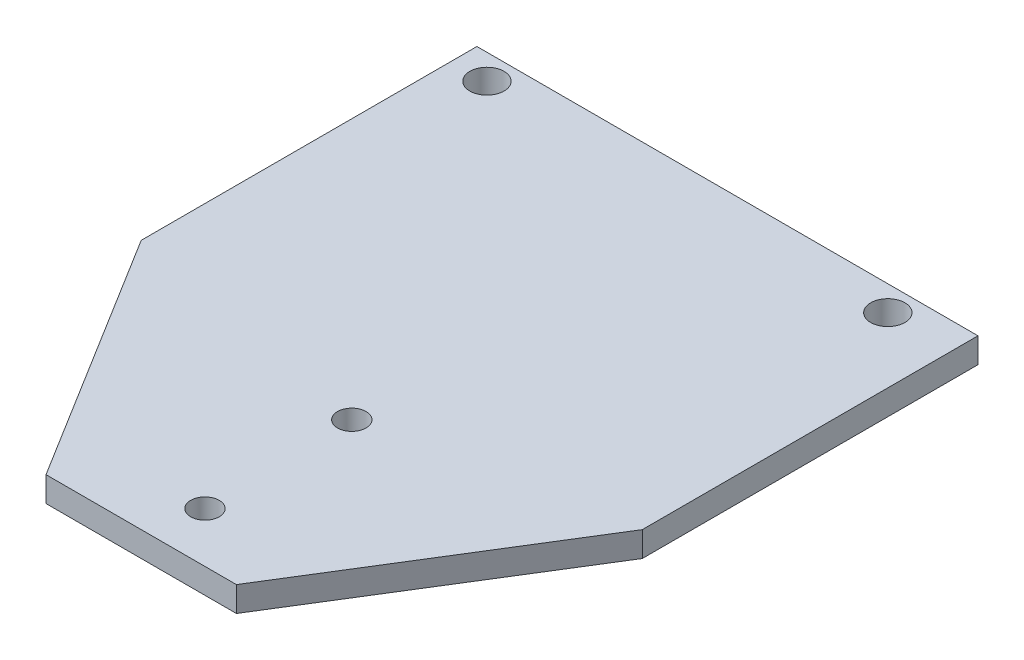
ISO-10303-21;
HEADER;
FILE_DESCRIPTION(('STEP AP214'),'2;1');
FILE_NAME('part.step','',(''),(''),'','','');
FILE_SCHEMA(('AUTOMOTIVE_DESIGN { 1 0 10303 214 1 1 1 1 }'));
ENDSEC;
DATA;
#1=APPLICATION_CONTEXT('core data for automotive mechanical design processes');
#2=APPLICATION_PROTOCOL_DEFINITION('international standard','automotive_design',2000,#1);
#3=PRODUCT_CONTEXT('',#1,'mechanical');
#4=PRODUCT('Part','Part','',(#3));
#5=PRODUCT_RELATED_PRODUCT_CATEGORY('part','',(#4));
#6=PRODUCT_DEFINITION_FORMATION('','',#4);
#7=PRODUCT_DEFINITION_CONTEXT('part definition',#1,'design');
#8=PRODUCT_DEFINITION('design','',#6,#7);
#9=PRODUCT_DEFINITION_SHAPE('','',#8);
#10=(LENGTH_UNIT() NAMED_UNIT(*) SI_UNIT(.MILLI.,.METRE.));
#11=(NAMED_UNIT(*) PLANE_ANGLE_UNIT() SI_UNIT($,.RADIAN.));
#12=(NAMED_UNIT(*) SI_UNIT($,.STERADIAN.) SOLID_ANGLE_UNIT());
#13=UNCERTAINTY_MEASURE_WITH_UNIT(LENGTH_MEASURE(1.E-05),#10,'distance_accuracy_value','');
#14=(GEOMETRIC_REPRESENTATION_CONTEXT(3) GLOBAL_UNCERTAINTY_ASSIGNED_CONTEXT((#13)) GLOBAL_UNIT_ASSIGNED_CONTEXT((#10,
#11,#12)) REPRESENTATION_CONTEXT('',''));
#15=CARTESIAN_POINT('',(0.,0.,0.));
#16=DIRECTION('',(0.,0.,1.));
#17=DIRECTION('',(1.,0.,0.));
#18=AXIS2_PLACEMENT_3D('',#15,#16,#17);
#19=CARTESIAN_POINT('',(0.,5.,0.));
#20=DIRECTION('',(0.,-1.,0.));
#21=DIRECTION('',(0.,0.,-1.));
#22=AXIS2_PLACEMENT_3D('',#19,#20,#21);
#23=PLANE('',#22);
#24=CARTESIAN_POINT('',(52.0288779734529,5.,10.));
#25=DIRECTION('',(0.,-1.,0.));
#26=DIRECTION('',(0.,0.,-1.));
#27=AXIS2_PLACEMENT_3D('',#24,#25,#26);
#28=CIRCLE('',#27,2.85);
#29=CARTESIAN_POINT('',(52.0288779734529,5.,7.15000000000001));
#30=VERTEX_POINT('',#29);
#31=EDGE_CURVE('E185',#30,#30,#28,.T.);
#32=ORIENTED_EDGE('',*,*,#31,.T.);
#33=EDGE_LOOP('',(#32));
#34=FACE_BOUND('',#33,.T.);
#35=CARTESIAN_POINT('',(52.7205409189483,5.,40.));
#36=DIRECTION('',(0.,-1.,0.));
#37=DIRECTION('',(0.,0.,-1.));
#38=AXIS2_PLACEMENT_3D('',#35,#36,#37);
#39=CIRCLE('',#38,2.85);
#40=CARTESIAN_POINT('',(52.7205409189483,5.,37.15));
#41=VERTEX_POINT('',#40);
#42=EDGE_CURVE('E187',#41,#41,#39,.T.);
#43=ORIENTED_EDGE('',*,*,#42,.T.);
#44=EDGE_LOOP('',(#43));
#45=FACE_BOUND('',#44,.T.);
#46=DIRECTION('',(0.526939668861675,0.,0.849902691712379));
#47=VECTOR('',#46,1.);
#48=CARTESIAN_POINT('',(31.,5.,50.));
#49=LINE('',#48,#47);
#50=CARTESIAN_POINT('',(0.,5.,0.));
#51=VERTEX_POINT('',#50);
#52=CARTESIAN_POINT('',(31.,5.,50.));
#53=VERTEX_POINT('',#52);
#54=EDGE_CURVE('E131',#51,#53,#49,.T.);
#55=ORIENTED_EDGE('',*,*,#54,.T.);
#56=DIRECTION('',(1.,0.,0.));
#57=VECTOR('',#56,1.);
#58=CARTESIAN_POINT('',(31.,5.,50.));
#59=LINE('',#58,#57);
#60=CARTESIAN_POINT('',(69.,5.,50.));
#61=VERTEX_POINT('',#60);
#62=EDGE_CURVE('E89',#53,#61,#59,.T.);
#63=ORIENTED_EDGE('',*,*,#62,.T.);
#64=DIRECTION('',(0.526939668861675,0.,-0.84990269171238));
#65=VECTOR('',#64,1.);
#66=CARTESIAN_POINT('',(69.,5.,50.));
#67=LINE('',#66,#65);
#68=CARTESIAN_POINT('',(100.,5.,0.));
#69=VERTEX_POINT('',#68);
#70=EDGE_CURVE('E102',#61,#69,#67,.T.);
#71=ORIENTED_EDGE('',*,*,#70,.T.);
#72=DIRECTION('',(0.,0.,-1.));
#73=VECTOR('',#72,1.);
#74=CARTESIAN_POINT('',(100.,5.,0.));
#75=LINE('',#74,#73);
#76=CARTESIAN_POINT('',(100.,5.,-67.));
#77=VERTEX_POINT('',#76);
#78=EDGE_CURVE('E96',#69,#77,#75,.T.);
#79=ORIENTED_EDGE('',*,*,#78,.T.);
#80=DIRECTION('',(-1.,0.,0.));
#81=VECTOR('',#80,1.);
#82=CARTESIAN_POINT('',(0.,5.,-67.));
#83=LINE('',#82,#81);
#84=CARTESIAN_POINT('',(0.,5.,-67.));
#85=VERTEX_POINT('',#84);
#86=EDGE_CURVE('E100',#77,#85,#83,.T.);
#87=ORIENTED_EDGE('',*,*,#86,.T.);
#88=DIRECTION('',(0.,0.,1.));
#89=VECTOR('',#88,1.);
#90=CARTESIAN_POINT('',(0.,5.,0.));
#91=LINE('',#90,#89);
#92=EDGE_CURVE('E52',#85,#51,#91,.T.);
#93=ORIENTED_EDGE('',*,*,#92,.T.);
#94=EDGE_LOOP('',(#55,#63,#71,#79,#87,#93));
#95=FACE_BOUND('',#94,.T.);
#96=CARTESIAN_POINT('',(7.,5.,-62.));
#97=DIRECTION('',(0.,1.,0.));
#98=DIRECTION('',(0.,0.,1.));
#99=AXIS2_PLACEMENT_3D('',#96,#97,#98);
#100=CIRCLE('',#99,3.415);
#101=CARTESIAN_POINT('',(7.,5.,-58.585));
#102=VERTEX_POINT('',#101);
#103=EDGE_CURVE('E124',#102,#102,#100,.T.);
#104=ORIENTED_EDGE('',*,*,#103,.F.);
#105=EDGE_LOOP('',(#104));
#106=FACE_BOUND('',#105,.T.);
#107=CARTESIAN_POINT('',(87.,5.,-62.));
#108=DIRECTION('',(0.,1.,0.));
#109=DIRECTION('',(0.,0.,1.));
#110=AXIS2_PLACEMENT_3D('',#107,#108,#109);
#111=CIRCLE('',#110,3.41509823187923);
#112=CARTESIAN_POINT('',(87.,5.,-58.5849017681208));
#113=VERTEX_POINT('',#112);
#114=EDGE_CURVE('E190',#113,#113,#111,.T.);
#115=ORIENTED_EDGE('',*,*,#114,.F.);
#116=EDGE_LOOP('',(#115));
#117=FACE_BOUND('',#116,.T.);
#118=ADVANCED_FACE('F35',(#34,#45,#95,#106,#117),#23,.F.);
#119=CARTESIAN_POINT('',(0.,0.,0.));
#120=DIRECTION('',(0.,-1.,0.));
#121=DIRECTION('',(0.,0.,-1.));
#122=AXIS2_PLACEMENT_3D('',#119,#120,#121);
#123=PLANE('',#122);
#124=CARTESIAN_POINT('',(52.0288779734529,0.,10.));
#125=DIRECTION('',(0.,1.,0.));
#126=DIRECTION('',(0.,0.,1.));
#127=AXIS2_PLACEMENT_3D('',#124,#125,#126);
#128=CIRCLE('',#127,2.85);
#129=CARTESIAN_POINT('',(52.0288779734529,0.,12.85));
#130=VERTEX_POINT('',#129);
#131=EDGE_CURVE('E183',#130,#130,#128,.T.);
#132=ORIENTED_EDGE('',*,*,#131,.T.);
#133=EDGE_LOOP('',(#132));
#134=FACE_BOUND('',#133,.T.);
#135=CARTESIAN_POINT('',(52.7205409189483,0.,40.));
#136=DIRECTION('',(0.,1.,0.));
#137=DIRECTION('',(0.,0.,1.));
#138=AXIS2_PLACEMENT_3D('',#135,#136,#137);
#139=CIRCLE('',#138,2.85);
#140=CARTESIAN_POINT('',(52.7205409189483,0.,42.85));
#141=VERTEX_POINT('',#140);
#142=EDGE_CURVE('E212',#141,#141,#139,.T.);
#143=ORIENTED_EDGE('',*,*,#142,.T.);
#144=EDGE_LOOP('',(#143));
#145=FACE_BOUND('',#144,.T.);
#146=CARTESIAN_POINT('',(7.,0.,-62.));
#147=DIRECTION('',(0.,1.,0.));
#148=DIRECTION('',(0.,0.,1.));
#149=AXIS2_PLACEMENT_3D('',#146,#147,#148);
#150=CIRCLE('',#149,3.415);
#151=CARTESIAN_POINT('',(7.,0.,-58.585));
#152=VERTEX_POINT('',#151);
#153=EDGE_CURVE('E197',#152,#152,#150,.T.);
#154=ORIENTED_EDGE('',*,*,#153,.T.);
#155=EDGE_LOOP('',(#154));
#156=FACE_BOUND('',#155,.T.);
#157=DIRECTION('',(0.526939668861675,0.,0.849902691712379));
#158=VECTOR('',#157,1.);
#159=CARTESIAN_POINT('',(31.,0.,50.));
#160=LINE('',#159,#158);
#161=CARTESIAN_POINT('',(0.,0.,0.));
#162=VERTEX_POINT('',#161);
#163=CARTESIAN_POINT('',(31.,0.,50.));
#164=VERTEX_POINT('',#163);
#165=EDGE_CURVE('E120',#162,#164,#160,.T.);
#166=ORIENTED_EDGE('',*,*,#165,.F.);
#167=DIRECTION('',(0.,0.,1.));
#168=VECTOR('',#167,1.);
#169=CARTESIAN_POINT('',(0.,0.,0.));
#170=LINE('',#169,#168);
#171=CARTESIAN_POINT('',(0.,0.,-67.));
#172=VERTEX_POINT('',#171);
#173=EDGE_CURVE('E81',#172,#162,#170,.T.);
#174=ORIENTED_EDGE('',*,*,#173,.F.);
#175=DIRECTION('',(-1.,0.,0.));
#176=VECTOR('',#175,1.);
#177=CARTESIAN_POINT('',(0.,0.,-67.));
#178=LINE('',#177,#176);
#179=CARTESIAN_POINT('',(100.,0.,-67.));
#180=VERTEX_POINT('',#179);
#181=EDGE_CURVE('E75',#180,#172,#178,.T.);
#182=ORIENTED_EDGE('',*,*,#181,.F.);
#183=DIRECTION('',(0.,0.,-1.));
#184=VECTOR('',#183,1.);
#185=CARTESIAN_POINT('',(100.,0.,0.));
#186=LINE('',#185,#184);
#187=CARTESIAN_POINT('',(100.,0.,0.));
#188=VERTEX_POINT('',#187);
#189=EDGE_CURVE('E110',#188,#180,#186,.T.);
#190=ORIENTED_EDGE('',*,*,#189,.F.);
#191=DIRECTION('',(0.526939668861675,0.,-0.84990269171238));
#192=VECTOR('',#191,1.);
#193=CARTESIAN_POINT('',(69.,0.,50.));
#194=LINE('',#193,#192);
#195=CARTESIAN_POINT('',(69.,0.,50.));
#196=VERTEX_POINT('',#195);
#197=EDGE_CURVE('E126',#196,#188,#194,.T.);
#198=ORIENTED_EDGE('',*,*,#197,.F.);
#199=DIRECTION('',(1.,0.,0.));
#200=VECTOR('',#199,1.);
#201=CARTESIAN_POINT('',(31.,0.,50.));
#202=LINE('',#201,#200);
#203=EDGE_CURVE('E123',#164,#196,#202,.T.);
#204=ORIENTED_EDGE('',*,*,#203,.F.);
#205=EDGE_LOOP('',(#166,#174,#182,#190,#198,#204));
#206=FACE_BOUND('',#205,.T.);
#207=CARTESIAN_POINT('',(87.,0.,-62.));
#208=DIRECTION('',(0.,1.,0.));
#209=DIRECTION('',(0.,0.,1.));
#210=AXIS2_PLACEMENT_3D('',#207,#208,#209);
#211=CIRCLE('',#210,3.41509823187923);
#212=CARTESIAN_POINT('',(87.,0.,-58.5849017681208));
#213=VERTEX_POINT('',#212);
#214=EDGE_CURVE('E186',#213,#213,#211,.T.);
#215=ORIENTED_EDGE('',*,*,#214,.T.);
#216=EDGE_LOOP('',(#215));
#217=FACE_BOUND('',#216,.T.);
#218=ADVANCED_FACE('F140',(#134,#145,#156,#206,#217),#123,.T.);
#219=CARTESIAN_POINT('',(31.,5.,50.));
#220=DIRECTION('',(0.84990269171238,0.,-0.526939668861675));
#221=DIRECTION('',(-0.526939668861675,0.,-0.84990269171238));
#222=AXIS2_PLACEMENT_3D('',#219,#220,#221);
#223=PLANE('',#222);
#224=ORIENTED_EDGE('',*,*,#165,.T.);
#225=DIRECTION('',(0.,-1.,0.));
#226=VECTOR('',#225,1.);
#227=CARTESIAN_POINT('',(31.,5.,50.));
#228=LINE('',#227,#226);
#229=EDGE_CURVE('E11',#53,#164,#228,.T.);
#230=ORIENTED_EDGE('',*,*,#229,.F.);
#231=ORIENTED_EDGE('',*,*,#54,.F.);
#232=DIRECTION('',(0.,-1.,0.));
#233=VECTOR('',#232,1.);
#234=CARTESIAN_POINT('',(0.,5.,0.));
#235=LINE('',#234,#233);
#236=EDGE_CURVE('E116',#51,#162,#235,.T.);
#237=ORIENTED_EDGE('',*,*,#236,.T.);
#238=EDGE_LOOP('',(#224,#230,#231,#237));
#239=FACE_BOUND('',#238,.T.);
#240=ADVANCED_FACE('F37',(#239),#223,.F.);
#241=CARTESIAN_POINT('',(31.,5.,50.));
#242=DIRECTION('',(0.,0.,-1.));
#243=DIRECTION('',(-1.,0.,0.));
#244=AXIS2_PLACEMENT_3D('',#241,#242,#243);
#245=PLANE('',#244);
#246=ORIENTED_EDGE('',*,*,#203,.T.);
#247=DIRECTION('',(0.,-1.,0.));
#248=VECTOR('',#247,1.);
#249=CARTESIAN_POINT('',(69.,5.,50.));
#250=LINE('',#249,#248);
#251=EDGE_CURVE('E44',#61,#196,#250,.T.);
#252=ORIENTED_EDGE('',*,*,#251,.F.);
#253=ORIENTED_EDGE('',*,*,#62,.F.);
#254=ORIENTED_EDGE('',*,*,#229,.T.);
#255=EDGE_LOOP('',(#246,#252,#253,#254));
#256=FACE_BOUND('',#255,.T.);
#257=ADVANCED_FACE('F259',(#256),#245,.F.);
#258=CARTESIAN_POINT('',(69.,5.,50.));
#259=DIRECTION('',(-0.84990269171238,0.,-0.526939668861675));
#260=DIRECTION('',(-0.526939668861675,0.,0.84990269171238));
#261=AXIS2_PLACEMENT_3D('',#258,#259,#260);
#262=PLANE('',#261);
#263=ORIENTED_EDGE('',*,*,#197,.T.);
#264=DIRECTION('',(0.,-1.,0.));
#265=VECTOR('',#264,1.);
#266=CARTESIAN_POINT('',(100.,5.,0.));
#267=LINE('',#266,#265);
#268=EDGE_CURVE('E111',#69,#188,#267,.T.);
#269=ORIENTED_EDGE('',*,*,#268,.F.);
#270=ORIENTED_EDGE('',*,*,#70,.F.);
#271=ORIENTED_EDGE('',*,*,#251,.T.);
#272=EDGE_LOOP('',(#263,#269,#270,#271));
#273=FACE_BOUND('',#272,.T.);
#274=ADVANCED_FACE('F137',(#273),#262,.F.);
#275=CARTESIAN_POINT('',(100.,5.,0.));
#276=DIRECTION('',(-1.,0.,0.));
#277=DIRECTION('',(0.,0.,1.));
#278=AXIS2_PLACEMENT_3D('',#275,#276,#277);
#279=PLANE('',#278);
#280=ORIENTED_EDGE('',*,*,#189,.T.);
#281=DIRECTION('',(0.,-1.,0.));
#282=VECTOR('',#281,1.);
#283=CARTESIAN_POINT('',(100.,5.,-67.));
#284=LINE('',#283,#282);
#285=EDGE_CURVE('E107',#77,#180,#284,.T.);
#286=ORIENTED_EDGE('',*,*,#285,.F.);
#287=ORIENTED_EDGE('',*,*,#78,.F.);
#288=ORIENTED_EDGE('',*,*,#268,.T.);
#289=EDGE_LOOP('',(#280,#286,#287,#288));
#290=FACE_BOUND('',#289,.T.);
#291=ADVANCED_FACE('F108',(#290),#279,.F.);
#292=CARTESIAN_POINT('',(0.,5.,-67.));
#293=DIRECTION('',(0.,0.,1.));
#294=DIRECTION('',(1.,0.,0.));
#295=AXIS2_PLACEMENT_3D('',#292,#293,#294);
#296=PLANE('',#295);
#297=ORIENTED_EDGE('',*,*,#181,.T.);
#298=DIRECTION('',(0.,-1.,0.));
#299=VECTOR('',#298,1.);
#300=CARTESIAN_POINT('',(0.,5.,-67.));
#301=LINE('',#300,#299);
#302=EDGE_CURVE('E112',#85,#172,#301,.T.);
#303=ORIENTED_EDGE('',*,*,#302,.F.);
#304=ORIENTED_EDGE('',*,*,#86,.F.);
#305=ORIENTED_EDGE('',*,*,#285,.T.);
#306=EDGE_LOOP('',(#297,#303,#304,#305));
#307=FACE_BOUND('',#306,.T.);
#308=ADVANCED_FACE('F114',(#307),#296,.F.);
#309=CARTESIAN_POINT('',(0.,5.,0.));
#310=DIRECTION('',(1.,0.,0.));
#311=DIRECTION('',(0.,0.,-1.));
#312=AXIS2_PLACEMENT_3D('',#309,#310,#311);
#313=PLANE('',#312);
#314=ORIENTED_EDGE('',*,*,#173,.T.);
#315=ORIENTED_EDGE('',*,*,#236,.F.);
#316=ORIENTED_EDGE('',*,*,#92,.F.);
#317=ORIENTED_EDGE('',*,*,#302,.T.);
#318=EDGE_LOOP('',(#314,#315,#316,#317));
#319=FACE_BOUND('',#318,.T.);
#320=ADVANCED_FACE('F145',(#319),#313,.F.);
#321=CARTESIAN_POINT('',(7.,5.,-62.));
#322=DIRECTION('',(0.,-1.,0.));
#323=DIRECTION('',(0.,0.,-1.));
#324=AXIS2_PLACEMENT_3D('',#321,#322,#323);
#325=CYLINDRICAL_SURFACE('',#324,3.415);
#326=ORIENTED_EDGE('',*,*,#103,.T.);
#327=EDGE_LOOP('',(#326));
#328=FACE_BOUND('',#327,.T.);
#329=ORIENTED_EDGE('',*,*,#153,.F.);
#330=EDGE_LOOP('',(#329));
#331=FACE_BOUND('',#330,.T.);
#332=ADVANCED_FACE('F147',(#328,#331),#325,.F.);
#333=CARTESIAN_POINT('',(87.,5.,-62.));
#334=DIRECTION('',(0.,-1.,0.));
#335=DIRECTION('',(0.,0.,-1.));
#336=AXIS2_PLACEMENT_3D('',#333,#334,#335);
#337=CYLINDRICAL_SURFACE('',#336,3.41509823187923);
#338=ORIENTED_EDGE('',*,*,#114,.T.);
#339=EDGE_LOOP('',(#338));
#340=FACE_BOUND('',#339,.T.);
#341=ORIENTED_EDGE('',*,*,#214,.F.);
#342=EDGE_LOOP('',(#341));
#343=FACE_BOUND('',#342,.T.);
#344=ADVANCED_FACE('F153',(#340,#343),#337,.F.);
#345=CARTESIAN_POINT('',(52.7205409189483,0.,40.));
#346=DIRECTION('',(0.,1.,0.));
#347=DIRECTION('',(0.,0.,1.));
#348=AXIS2_PLACEMENT_3D('',#345,#346,#347);
#349=CYLINDRICAL_SURFACE('',#348,2.85);
#350=ORIENTED_EDGE('',*,*,#142,.F.);
#351=EDGE_LOOP('',(#350));
#352=FACE_BOUND('',#351,.T.);
#353=ORIENTED_EDGE('',*,*,#42,.F.);
#354=EDGE_LOOP('',(#353));
#355=FACE_BOUND('',#354,.T.);
#356=ADVANCED_FACE('F170',(#352,#355),#349,.F.);
#357=CARTESIAN_POINT('',(52.0288779734529,0.,10.));
#358=DIRECTION('',(0.,1.,0.));
#359=DIRECTION('',(0.,0.,1.));
#360=AXIS2_PLACEMENT_3D('',#357,#358,#359);
#361=CYLINDRICAL_SURFACE('',#360,2.85);
#362=ORIENTED_EDGE('',*,*,#131,.F.);
#363=EDGE_LOOP('',(#362));
#364=FACE_BOUND('',#363,.T.);
#365=ORIENTED_EDGE('',*,*,#31,.F.);
#366=EDGE_LOOP('',(#365));
#367=FACE_BOUND('',#366,.T.);
#368=ADVANCED_FACE('F174',(#364,#367),#361,.F.);
#369=CLOSED_SHELL('',(#118,#218,#240,#257,#274,#291,#308,#320,#332,#344,#356,#368));
#370=MANIFOLD_SOLID_BREP('B2',#369);
#371=ADVANCED_BREP_SHAPE_REPRESENTATION('',(#18,#370),#14);
#372=SHAPE_DEFINITION_REPRESENTATION(#9,#371);
ENDSEC;
END-ISO-10303-21;
